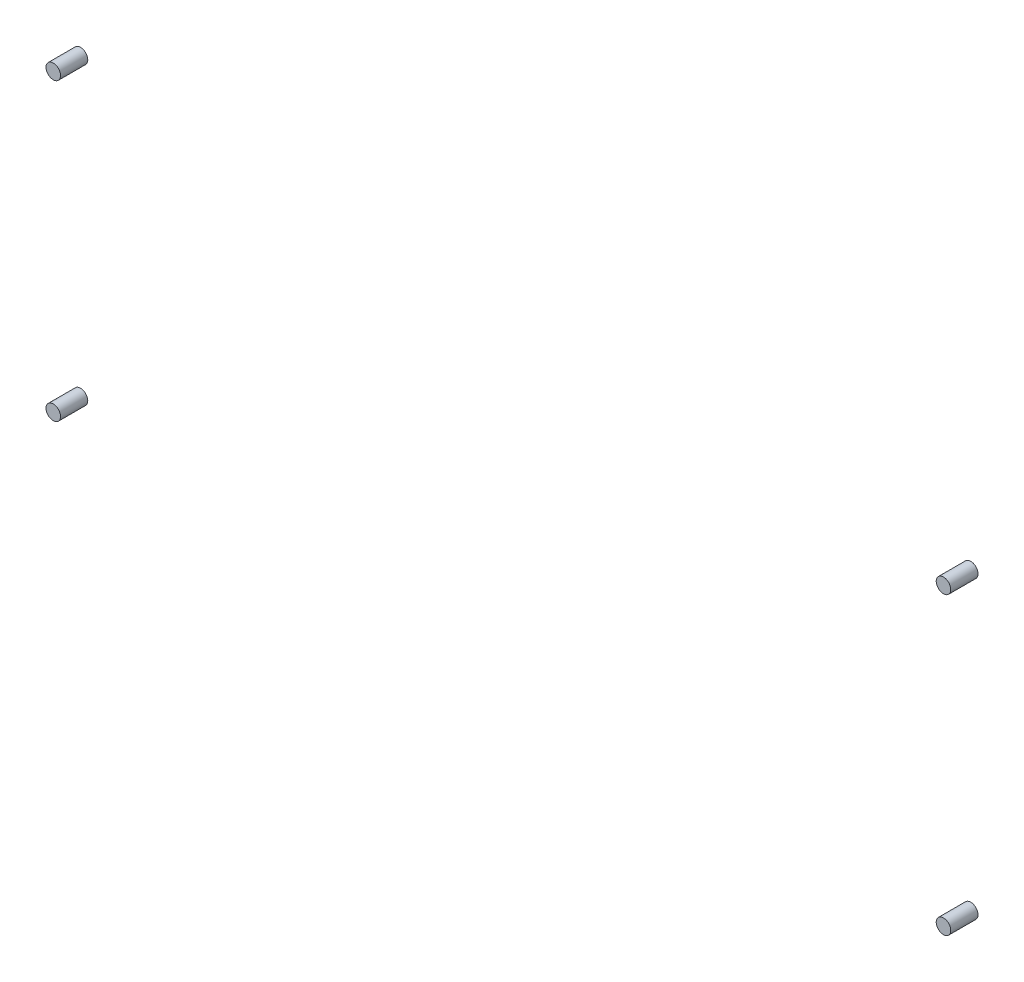
ISO-10303-21;
HEADER;
FILE_DESCRIPTION(('STEP AP214'),'2;1');
FILE_NAME('part.step','',(''),(''),'','','');
FILE_SCHEMA(('AUTOMOTIVE_DESIGN { 1 0 10303 214 1 1 1 1 }'));
ENDSEC;
DATA;
#1=APPLICATION_CONTEXT('core data for automotive mechanical design processes');
#2=APPLICATION_PROTOCOL_DEFINITION('international standard','automotive_design',2000,#1);
#3=PRODUCT_CONTEXT('',#1,'mechanical');
#4=PRODUCT('Part','Part','',(#3));
#5=PRODUCT_RELATED_PRODUCT_CATEGORY('part','',(#4));
#6=PRODUCT_DEFINITION_FORMATION('','',#4);
#7=PRODUCT_DEFINITION_CONTEXT('part definition',#1,'design');
#8=PRODUCT_DEFINITION('design','',#6,#7);
#9=PRODUCT_DEFINITION_SHAPE('','',#8);
#10=(LENGTH_UNIT() NAMED_UNIT(*) SI_UNIT(.MILLI.,.METRE.));
#11=(NAMED_UNIT(*) PLANE_ANGLE_UNIT() SI_UNIT($,.RADIAN.));
#12=(NAMED_UNIT(*) SI_UNIT($,.STERADIAN.) SOLID_ANGLE_UNIT());
#13=UNCERTAINTY_MEASURE_WITH_UNIT(LENGTH_MEASURE(1.E-05),#10,'distance_accuracy_value','');
#14=(GEOMETRIC_REPRESENTATION_CONTEXT(3) GLOBAL_UNCERTAINTY_ASSIGNED_CONTEXT((#13)) GLOBAL_UNIT_ASSIGNED_CONTEXT((#10,
#11,#12)) REPRESENTATION_CONTEXT('',''));
#15=CARTESIAN_POINT('',(0.,0.,0.));
#16=DIRECTION('',(0.,0.,1.));
#17=DIRECTION('',(1.,0.,0.));
#18=AXIS2_PLACEMENT_3D('',#15,#16,#17);
#19=CARTESIAN_POINT('',(0.,0.,0.));
#20=DIRECTION('',(0.,0.,1.));
#21=DIRECTION('',(1.,0.,0.));
#22=AXIS2_PLACEMENT_3D('',#19,#20,#21);
#23=PLANE('',#22);
#24=CARTESIAN_POINT('',(412.,88.,0.));
#25=DIRECTION('',(0.,0.,1.));
#26=DIRECTION('',(1.,0.,0.));
#27=AXIS2_PLACEMENT_3D('',#24,#25,#26);
#28=CIRCLE('',#27,3.19999999999998);
#29=CARTESIAN_POINT('',(415.2,88.,0.));
#30=VERTEX_POINT('',#29);
#31=EDGE_CURVE('E55',#30,#30,#28,.T.);
#32=ORIENTED_EDGE('',*,*,#31,.F.);
#33=EDGE_LOOP('',(#32));
#34=FACE_BOUND('',#33,.T.);
#35=ADVANCED_FACE('F51',(#34),#23,.F.);
#36=CARTESIAN_POINT('',(412.,88.,0.));
#37=DIRECTION('',(0.,0.,1.));
#38=DIRECTION('',(1.,0.,0.));
#39=AXIS2_PLACEMENT_3D('',#36,#37,#38);
#40=CYLINDRICAL_SURFACE('',#39,3.19999999999998);
#41=ORIENTED_EDGE('',*,*,#31,.T.);
#42=EDGE_LOOP('',(#41));
#43=FACE_BOUND('',#42,.T.);
#44=CARTESIAN_POINT('',(412.,88.,12.));
#45=DIRECTION('',(0.,0.,1.));
#46=DIRECTION('',(1.,0.,0.));
#47=AXIS2_PLACEMENT_3D('',#44,#45,#46);
#48=CIRCLE('',#47,3.19999999999998);
#49=CARTESIAN_POINT('',(415.2,88.,12.));
#50=VERTEX_POINT('',#49);
#51=EDGE_CURVE('E12',#50,#50,#48,.T.);
#52=ORIENTED_EDGE('',*,*,#51,.F.);
#53=EDGE_LOOP('',(#52));
#54=FACE_BOUND('',#53,.T.);
#55=ADVANCED_FACE('F64',(#43,#54),#40,.T.);
#56=CARTESIAN_POINT('',(0.,0.,12.));
#57=DIRECTION('',(0.,0.,1.));
#58=DIRECTION('',(1.,0.,0.));
#59=AXIS2_PLACEMENT_3D('',#56,#57,#58);
#60=PLANE('',#59);
#61=ORIENTED_EDGE('',*,*,#51,.T.);
#62=EDGE_LOOP('',(#61));
#63=FACE_BOUND('',#62,.T.);
#64=ADVANCED_FACE('F53',(#63),#60,.T.);
#65=CLOSED_SHELL('',(#35,#55,#64));
#66=MANIFOLD_SOLID_BREP('B2',#65);
#67=CARTESIAN_POINT('',(0.,0.,0.));
#68=DIRECTION('',(0.,0.,1.));
#69=DIRECTION('',(1.,0.,0.));
#70=AXIS2_PLACEMENT_3D('',#67,#68,#69);
#71=PLANE('',#70);
#72=CARTESIAN_POINT('',(20.,88.,0.));
#73=DIRECTION('',(0.,0.,1.));
#74=DIRECTION('',(1.,0.,0.));
#75=AXIS2_PLACEMENT_3D('',#72,#73,#74);
#76=CIRCLE('',#75,3.2);
#77=CARTESIAN_POINT('',(23.2,88.,0.));
#78=VERTEX_POINT('',#77);
#79=EDGE_CURVE('E104',#78,#78,#76,.T.);
#80=ORIENTED_EDGE('',*,*,#79,.F.);
#81=EDGE_LOOP('',(#80));
#82=FACE_BOUND('',#81,.T.);
#83=ADVANCED_FACE('F100',(#82),#71,.F.);
#84=CARTESIAN_POINT('',(20.,88.,0.));
#85=DIRECTION('',(0.,0.,1.));
#86=DIRECTION('',(1.,0.,0.));
#87=AXIS2_PLACEMENT_3D('',#84,#85,#86);
#88=CYLINDRICAL_SURFACE('',#87,3.2);
#89=ORIENTED_EDGE('',*,*,#79,.T.);
#90=EDGE_LOOP('',(#89));
#91=FACE_BOUND('',#90,.T.);
#92=CARTESIAN_POINT('',(20.,88.,12.));
#93=DIRECTION('',(0.,0.,1.));
#94=DIRECTION('',(1.,0.,0.));
#95=AXIS2_PLACEMENT_3D('',#92,#93,#94);
#96=CIRCLE('',#95,3.2);
#97=CARTESIAN_POINT('',(23.2,88.,12.));
#98=VERTEX_POINT('',#97);
#99=EDGE_CURVE('E50',#98,#98,#96,.T.);
#100=ORIENTED_EDGE('',*,*,#99,.F.);
#101=EDGE_LOOP('',(#100));
#102=FACE_BOUND('',#101,.T.);
#103=ADVANCED_FACE('F113',(#91,#102),#88,.T.);
#104=CARTESIAN_POINT('',(0.,0.,12.));
#105=DIRECTION('',(0.,0.,1.));
#106=DIRECTION('',(1.,0.,0.));
#107=AXIS2_PLACEMENT_3D('',#104,#105,#106);
#108=PLANE('',#107);
#109=ORIENTED_EDGE('',*,*,#99,.T.);
#110=EDGE_LOOP('',(#109));
#111=FACE_BOUND('',#110,.T.);
#112=ADVANCED_FACE('F102',(#111),#108,.T.);
#113=CLOSED_SHELL('',(#83,#103,#112));
#114=MANIFOLD_SOLID_BREP('B7',#113);
#115=CARTESIAN_POINT('',(0.,0.,0.));
#116=DIRECTION('',(0.,0.,1.));
#117=DIRECTION('',(1.,0.,0.));
#118=AXIS2_PLACEMENT_3D('',#115,#116,#117);
#119=PLANE('',#118);
#120=CARTESIAN_POINT('',(412.,-42.,0.));
#121=DIRECTION('',(0.,0.,1.));
#122=DIRECTION('',(1.,0.,0.));
#123=AXIS2_PLACEMENT_3D('',#120,#121,#122);
#124=CIRCLE('',#123,3.19999999999998);
#125=CARTESIAN_POINT('',(415.2,-42.,0.));
#126=VERTEX_POINT('',#125);
#127=EDGE_CURVE('E152',#126,#126,#124,.T.);
#128=ORIENTED_EDGE('',*,*,#127,.F.);
#129=EDGE_LOOP('',(#128));
#130=FACE_BOUND('',#129,.T.);
#131=ADVANCED_FACE('F148',(#130),#119,.F.);
#132=CARTESIAN_POINT('',(412.,-42.,0.));
#133=DIRECTION('',(0.,0.,1.));
#134=DIRECTION('',(1.,0.,0.));
#135=AXIS2_PLACEMENT_3D('',#132,#133,#134);
#136=CYLINDRICAL_SURFACE('',#135,3.19999999999998);
#137=ORIENTED_EDGE('',*,*,#127,.T.);
#138=EDGE_LOOP('',(#137));
#139=FACE_BOUND('',#138,.T.);
#140=CARTESIAN_POINT('',(412.,-42.,12.));
#141=DIRECTION('',(0.,0.,1.));
#142=DIRECTION('',(1.,0.,0.));
#143=AXIS2_PLACEMENT_3D('',#140,#141,#142);
#144=CIRCLE('',#143,3.19999999999998);
#145=CARTESIAN_POINT('',(415.2,-42.,12.));
#146=VERTEX_POINT('',#145);
#147=EDGE_CURVE('E99',#146,#146,#144,.T.);
#148=ORIENTED_EDGE('',*,*,#147,.F.);
#149=EDGE_LOOP('',(#148));
#150=FACE_BOUND('',#149,.T.);
#151=ADVANCED_FACE('F161',(#139,#150),#136,.T.);
#152=CARTESIAN_POINT('',(0.,0.,12.));
#153=DIRECTION('',(0.,0.,1.));
#154=DIRECTION('',(1.,0.,0.));
#155=AXIS2_PLACEMENT_3D('',#152,#153,#154);
#156=PLANE('',#155);
#157=ORIENTED_EDGE('',*,*,#147,.T.);
#158=EDGE_LOOP('',(#157));
#159=FACE_BOUND('',#158,.T.);
#160=ADVANCED_FACE('F150',(#159),#156,.T.);
#161=CLOSED_SHELL('',(#131,#151,#160));
#162=MANIFOLD_SOLID_BREP('B45',#161);
#163=CARTESIAN_POINT('',(0.,0.,0.));
#164=DIRECTION('',(0.,0.,1.));
#165=DIRECTION('',(1.,0.,0.));
#166=AXIS2_PLACEMENT_3D('',#163,#164,#165);
#167=PLANE('',#166);
#168=CARTESIAN_POINT('',(20.,-42.,0.));
#169=DIRECTION('',(0.,0.,1.));
#170=DIRECTION('',(1.,0.,0.));
#171=AXIS2_PLACEMENT_3D('',#168,#169,#170);
#172=CIRCLE('',#171,3.2);
#173=CARTESIAN_POINT('',(23.2,-42.,0.));
#174=VERTEX_POINT('',#173);
#175=EDGE_CURVE('E147',#174,#174,#172,.T.);
#176=ORIENTED_EDGE('',*,*,#175,.F.);
#177=EDGE_LOOP('',(#176));
#178=FACE_BOUND('',#177,.T.);
#179=ADVANCED_FACE('F189',(#178),#167,.F.);
#180=CARTESIAN_POINT('',(20.,-42.,0.));
#181=DIRECTION('',(0.,0.,1.));
#182=DIRECTION('',(1.,0.,0.));
#183=AXIS2_PLACEMENT_3D('',#180,#181,#182);
#184=CYLINDRICAL_SURFACE('',#183,3.2);
#185=ORIENTED_EDGE('',*,*,#175,.T.);
#186=EDGE_LOOP('',(#185));
#187=FACE_BOUND('',#186,.T.);
#188=CARTESIAN_POINT('',(20.,-42.,12.));
#189=DIRECTION('',(0.,0.,1.));
#190=DIRECTION('',(1.,0.,0.));
#191=AXIS2_PLACEMENT_3D('',#188,#189,#190);
#192=CIRCLE('',#191,3.2);
#193=CARTESIAN_POINT('',(23.2,-42.,12.));
#194=VERTEX_POINT('',#193);
#195=EDGE_CURVE('E192',#194,#194,#192,.T.);
#196=ORIENTED_EDGE('',*,*,#195,.F.);
#197=EDGE_LOOP('',(#196));
#198=FACE_BOUND('',#197,.T.);
#199=ADVANCED_FACE('F203',(#187,#198),#184,.T.);
#200=CARTESIAN_POINT('',(0.,0.,12.));
#201=DIRECTION('',(0.,0.,1.));
#202=DIRECTION('',(1.,0.,0.));
#203=AXIS2_PLACEMENT_3D('',#200,#201,#202);
#204=PLANE('',#203);
#205=ORIENTED_EDGE('',*,*,#195,.T.);
#206=EDGE_LOOP('',(#205));
#207=FACE_BOUND('',#206,.T.);
#208=ADVANCED_FACE('F201',(#207),#204,.T.);
#209=CLOSED_SHELL('',(#179,#199,#208));
#210=MANIFOLD_SOLID_BREP('B94',#209);
#211=ADVANCED_BREP_SHAPE_REPRESENTATION('',(#18,#66,#114,#162,#210),#14);
#212=SHAPE_DEFINITION_REPRESENTATION(#9,#211);
ENDSEC;
END-ISO-10303-21;
